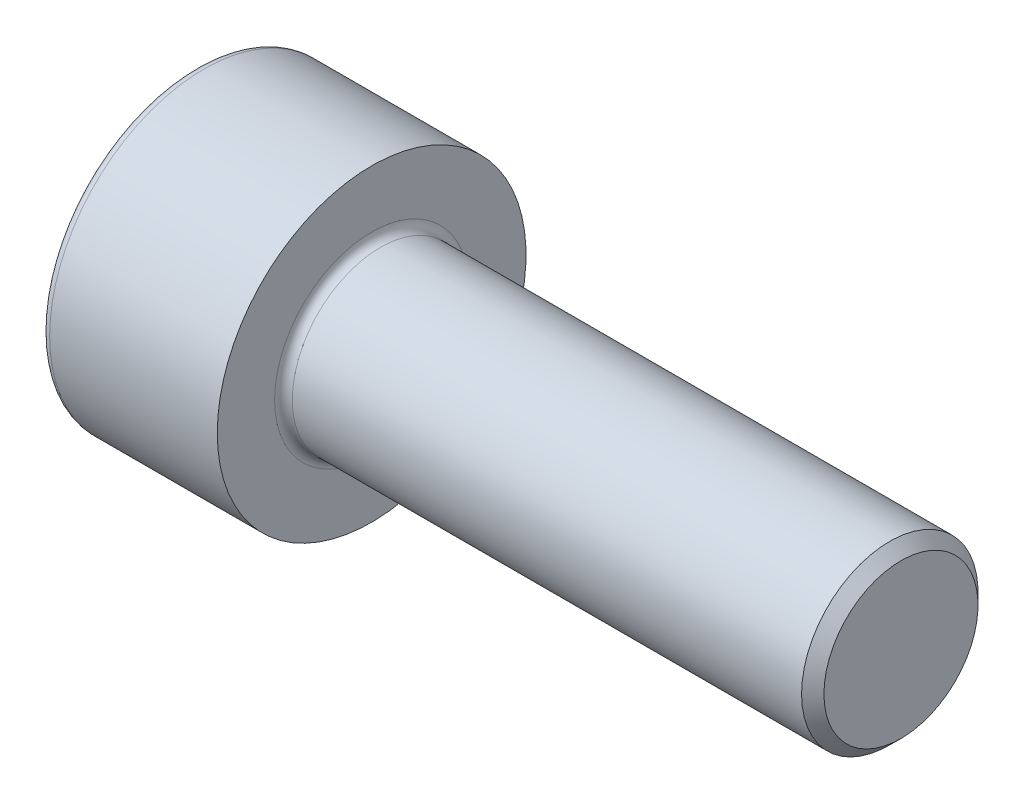
ISO-10303-21;
HEADER;
FILE_DESCRIPTION(('STEP AP214'),'2;1');
FILE_NAME('part.step','',(''),(''),'','','');
FILE_SCHEMA(('AUTOMOTIVE_DESIGN { 1 0 10303 214 1 1 1 1 }'));
ENDSEC;
DATA;
#1=APPLICATION_CONTEXT('core data for automotive mechanical design processes');
#2=APPLICATION_PROTOCOL_DEFINITION('international standard','automotive_design',2000,#1);
#3=PRODUCT_CONTEXT('',#1,'mechanical');
#4=PRODUCT('Part','Part','',(#3));
#5=PRODUCT_RELATED_PRODUCT_CATEGORY('part','',(#4));
#6=PRODUCT_DEFINITION_FORMATION('','',#4);
#7=PRODUCT_DEFINITION_CONTEXT('part definition',#1,'design');
#8=PRODUCT_DEFINITION('design','',#6,#7);
#9=PRODUCT_DEFINITION_SHAPE('','',#8);
#10=(LENGTH_UNIT() NAMED_UNIT(*) SI_UNIT(.MILLI.,.METRE.));
#11=(NAMED_UNIT(*) PLANE_ANGLE_UNIT() SI_UNIT($,.RADIAN.));
#12=(NAMED_UNIT(*) SI_UNIT($,.STERADIAN.) SOLID_ANGLE_UNIT());
#13=UNCERTAINTY_MEASURE_WITH_UNIT(LENGTH_MEASURE(1.E-05),#10,'distance_accuracy_value','');
#14=(GEOMETRIC_REPRESENTATION_CONTEXT(3) GLOBAL_UNCERTAINTY_ASSIGNED_CONTEXT((#13)) GLOBAL_UNIT_ASSIGNED_CONTEXT((#10,
#11,#12)) REPRESENTATION_CONTEXT('',''));
#15=CARTESIAN_POINT('',(0.,0.,0.));
#16=DIRECTION('',(0.,0.,1.));
#17=DIRECTION('',(1.,0.,0.));
#18=AXIS2_PLACEMENT_3D('',#15,#16,#17);
#19=CARTESIAN_POINT('',(12.,0.,0.));
#20=DIRECTION('',(-1.,0.,0.));
#21=DIRECTION('',(0.,0.,1.));
#22=AXIS2_PLACEMENT_3D('',#19,#20,#21);
#23=CONICAL_SURFACE('',#22,1.7464999999935,0.785398163397449);
#24=CARTESIAN_POINT('',(11.7464999999935,0.,0.));
#25=DIRECTION('',(-1.,0.,0.));
#26=DIRECTION('',(0.,0.,1.));
#27=AXIS2_PLACEMENT_3D('',#24,#25,#26);
#28=CIRCLE('',#27,2.);
#29=CARTESIAN_POINT('',(11.7464999999935,0.,2.));
#30=VERTEX_POINT('',#29);
#31=EDGE_CURVE('E11',#30,#30,#28,.T.);
#32=ORIENTED_EDGE('',*,*,#31,.F.);
#33=EDGE_LOOP('',(#32));
#34=FACE_BOUND('',#33,.T.);
#35=CARTESIAN_POINT('',(12.,0.,0.));
#36=DIRECTION('',(-1.,0.,0.));
#37=DIRECTION('',(0.,0.,1.));
#38=AXIS2_PLACEMENT_3D('',#35,#36,#37);
#39=CIRCLE('',#38,1.7464999999935);
#40=CARTESIAN_POINT('',(12.,0.,1.7464999999935));
#41=VERTEX_POINT('',#40);
#42=EDGE_CURVE('E134',#41,#41,#39,.T.);
#43=ORIENTED_EDGE('',*,*,#42,.T.);
#44=EDGE_LOOP('',(#43));
#45=FACE_BOUND('',#44,.T.);
#46=ADVANCED_FACE('F33',(#34,#45),#23,.T.);
#47=CARTESIAN_POINT('',(-4.,0.,0.));
#48=DIRECTION('',(-1.,0.,0.));
#49=DIRECTION('',(0.,0.,1.));
#50=AXIS2_PLACEMENT_3D('',#47,#48,#49);
#51=CYLINDRICAL_SURFACE('',#50,2.);
#52=CARTESIAN_POINT('',(0.200000000000001,0.,0.));
#53=DIRECTION('',(-1.,0.,0.));
#54=DIRECTION('',(0.,0.,1.));
#55=AXIS2_PLACEMENT_3D('',#52,#53,#54);
#56=CIRCLE('',#55,2.);
#57=CARTESIAN_POINT('',(0.200000000000001,0.,2.));
#58=VERTEX_POINT('',#57);
#59=EDGE_CURVE('E40',#58,#58,#56,.T.);
#60=ORIENTED_EDGE('',*,*,#59,.F.);
#61=EDGE_LOOP('',(#60));
#62=FACE_BOUND('',#61,.T.);
#63=ORIENTED_EDGE('',*,*,#31,.T.);
#64=EDGE_LOOP('',(#63));
#65=FACE_BOUND('',#64,.T.);
#66=ADVANCED_FACE('F158',(#62,#65),#51,.T.);
#67=CARTESIAN_POINT('',(0.2,0.,0.));
#68=DIRECTION('',(-1.,0.,0.));
#69=DIRECTION('',(0.,0.,1.));
#70=AXIS2_PLACEMENT_3D('',#67,#68,#69);
#71=TOROIDAL_SURFACE('',#70,2.2,0.2);
#72=CARTESIAN_POINT('',(0.,0.,0.));
#73=DIRECTION('',(-1.,0.,0.));
#74=DIRECTION('',(0.,0.,1.));
#75=AXIS2_PLACEMENT_3D('',#72,#73,#74);
#76=CIRCLE('',#75,2.2);
#77=CARTESIAN_POINT('',(0.,0.,2.2));
#78=VERTEX_POINT('',#77);
#79=EDGE_CURVE('E151',#78,#78,#76,.T.);
#80=ORIENTED_EDGE('',*,*,#79,.F.);
#81=EDGE_LOOP('',(#80));
#82=FACE_BOUND('',#81,.T.);
#83=ORIENTED_EDGE('',*,*,#59,.T.);
#84=EDGE_LOOP('',(#83));
#85=FACE_BOUND('',#84,.T.);
#86=ADVANCED_FACE('F156',(#82,#85),#71,.F.);
#87=CARTESIAN_POINT('',(0.,2.2,0.));
#88=DIRECTION('',(-1.,0.,0.));
#89=DIRECTION('',(0.,0.,1.));
#90=AXIS2_PLACEMENT_3D('',#87,#88,#89);
#91=PLANE('',#90);
#92=CARTESIAN_POINT('',(0.,0.,0.));
#93=DIRECTION('',(-1.,0.,0.));
#94=DIRECTION('',(0.,0.,1.));
#95=AXIS2_PLACEMENT_3D('',#92,#93,#94);
#96=CIRCLE('',#95,3.5);
#97=CARTESIAN_POINT('',(0.,0.,3.5));
#98=VERTEX_POINT('',#97);
#99=EDGE_CURVE('E148',#98,#98,#96,.T.);
#100=ORIENTED_EDGE('',*,*,#99,.F.);
#101=EDGE_LOOP('',(#100));
#102=FACE_BOUND('',#101,.T.);
#103=ORIENTED_EDGE('',*,*,#79,.T.);
#104=EDGE_LOOP('',(#103));
#105=FACE_BOUND('',#104,.T.);
#106=ADVANCED_FACE('F189',(#102,#105),#91,.F.);
#107=CARTESIAN_POINT('',(-4.,0.,0.));
#108=DIRECTION('',(-1.,0.,0.));
#109=DIRECTION('',(0.,0.,1.));
#110=AXIS2_PLACEMENT_3D('',#107,#108,#109);
#111=CYLINDRICAL_SURFACE('',#110,3.5);
#112=CARTESIAN_POINT('',(-3.8,0.,0.));
#113=DIRECTION('',(-1.,0.,0.));
#114=DIRECTION('',(0.,0.,1.));
#115=AXIS2_PLACEMENT_3D('',#112,#113,#114);
#116=CIRCLE('',#115,3.5);
#117=CARTESIAN_POINT('',(-3.8,0.,3.5));
#118=VERTEX_POINT('',#117);
#119=EDGE_CURVE('E145',#118,#118,#116,.T.);
#120=ORIENTED_EDGE('',*,*,#119,.F.);
#121=EDGE_LOOP('',(#120));
#122=FACE_BOUND('',#121,.T.);
#123=ORIENTED_EDGE('',*,*,#99,.T.);
#124=EDGE_LOOP('',(#123));
#125=FACE_BOUND('',#124,.T.);
#126=ADVANCED_FACE('F185',(#122,#125),#111,.T.);
#127=CARTESIAN_POINT('',(-3.8,0.,0.));
#128=DIRECTION('',(-1.,0.,0.));
#129=DIRECTION('',(0.,0.,1.));
#130=AXIS2_PLACEMENT_3D('',#127,#128,#129);
#131=TOROIDAL_SURFACE('',#130,3.3,0.200000000000001);
#132=CARTESIAN_POINT('',(-4.,0.,0.));
#133=DIRECTION('',(-1.,0.,0.));
#134=DIRECTION('',(0.,0.,1.));
#135=AXIS2_PLACEMENT_3D('',#132,#133,#134);
#136=CIRCLE('',#135,3.3);
#137=CARTESIAN_POINT('',(-4.,0.,3.3));
#138=VERTEX_POINT('',#137);
#139=EDGE_CURVE('E142',#138,#138,#136,.T.);
#140=ORIENTED_EDGE('',*,*,#139,.F.);
#141=EDGE_LOOP('',(#140));
#142=FACE_BOUND('',#141,.T.);
#143=ORIENTED_EDGE('',*,*,#119,.T.);
#144=EDGE_LOOP('',(#143));
#145=FACE_BOUND('',#144,.T.);
#146=ADVANCED_FACE('F178',(#142,#145),#131,.T.);
#147=CARTESIAN_POINT('',(-4.,3.3,0.));
#148=DIRECTION('',(1.,0.,0.));
#149=DIRECTION('',(0.,0.,-1.));
#150=AXIS2_PLACEMENT_3D('',#147,#148,#149);
#151=PLANE('',#150);
#152=DIRECTION('',(0.,0.5,-0.866025403784438));
#153=VECTOR('',#152,1.);
#154=CARTESIAN_POINT('',(-4.,0.886232663206076,1.535));
#155=LINE('',#154,#153);
#156=CARTESIAN_POINT('',(-4.,0.886232663206076,1.535));
#157=VERTEX_POINT('',#156);
#158=CARTESIAN_POINT('',(-4.,1.77246532641215,0.));
#159=VERTEX_POINT('',#158);
#160=EDGE_CURVE('E121',#157,#159,#155,.T.);
#161=ORIENTED_EDGE('',*,*,#160,.F.);
#162=DIRECTION('',(0.,1.,0.));
#163=VECTOR('',#162,1.);
#164=CARTESIAN_POINT('',(-4.,-0.886232663206076,1.535));
#165=LINE('',#164,#163);
#166=CARTESIAN_POINT('',(-4.,-0.886232663206076,1.535));
#167=VERTEX_POINT('',#166);
#168=EDGE_CURVE('E47',#167,#157,#165,.T.);
#169=ORIENTED_EDGE('',*,*,#168,.F.);
#170=DIRECTION('',(0.,0.5,0.866025403784439));
#171=VECTOR('',#170,1.);
#172=CARTESIAN_POINT('',(-4.,-1.77246532641215,0.));
#173=LINE('',#172,#171);
#174=CARTESIAN_POINT('',(-4.,-1.77246532641215,0.));
#175=VERTEX_POINT('',#174);
#176=EDGE_CURVE('E130',#175,#167,#173,.T.);
#177=ORIENTED_EDGE('',*,*,#176,.F.);
#178=DIRECTION('',(0.,-0.5,0.866025403784439));
#179=VECTOR('',#178,1.);
#180=CARTESIAN_POINT('',(-4.,-0.886232663206076,-1.535));
#181=LINE('',#180,#179);
#182=CARTESIAN_POINT('',(-4.,-0.886232663206076,-1.535));
#183=VERTEX_POINT('',#182);
#184=EDGE_CURVE('E128',#183,#175,#181,.T.);
#185=ORIENTED_EDGE('',*,*,#184,.F.);
#186=DIRECTION('',(0.,-1.,0.));
#187=VECTOR('',#186,1.);
#188=CARTESIAN_POINT('',(-4.,0.886232663206076,-1.535));
#189=LINE('',#188,#187);
#190=CARTESIAN_POINT('',(-4.,0.886232663206076,-1.535));
#191=VERTEX_POINT('',#190);
#192=EDGE_CURVE('E95',#191,#183,#189,.T.);
#193=ORIENTED_EDGE('',*,*,#192,.F.);
#194=DIRECTION('',(0.,-0.5,-0.866025403784439));
#195=VECTOR('',#194,1.);
#196=CARTESIAN_POINT('',(-4.,1.77246532641215,0.));
#197=LINE('',#196,#195);
#198=EDGE_CURVE('E124',#159,#191,#197,.T.);
#199=ORIENTED_EDGE('',*,*,#198,.F.);
#200=EDGE_LOOP('',(#161,#169,#177,#185,#193,#199));
#201=FACE_BOUND('',#200,.T.);
#202=ORIENTED_EDGE('',*,*,#139,.T.);
#203=EDGE_LOOP('',(#202));
#204=FACE_BOUND('',#203,.T.);
#205=ADVANCED_FACE('F170',(#201,#204),#151,.F.);
#206=CARTESIAN_POINT('',(12.,1.7464999999935,0.));
#207=DIRECTION('',(-1.,0.,0.));
#208=DIRECTION('',(0.,0.,1.));
#209=AXIS2_PLACEMENT_3D('',#206,#207,#208);
#210=PLANE('',#209);
#211=ORIENTED_EDGE('',*,*,#42,.F.);
#212=EDGE_LOOP('',(#211));
#213=FACE_BOUND('',#212,.T.);
#214=ADVANCED_FACE('F167',(#213),#210,.F.);
#215=CARTESIAN_POINT('',(-2.,-0.886232663206076,1.535));
#216=DIRECTION('',(0.,0.,1.));
#217=DIRECTION('',(1.,0.,0.));
#218=AXIS2_PLACEMENT_3D('',#215,#216,#217);
#219=PLANE('',#218);
#220=ORIENTED_EDGE('',*,*,#168,.T.);
#221=DIRECTION('',(-1.,0.,0.));
#222=VECTOR('',#221,1.);
#223=CARTESIAN_POINT('',(-2.,0.886232663206076,1.535));
#224=LINE('',#223,#222);
#225=CARTESIAN_POINT('',(-2.,0.886232663206076,1.535));
#226=VERTEX_POINT('',#225);
#227=EDGE_CURVE('E77',#226,#157,#224,.T.);
#228=ORIENTED_EDGE('',*,*,#227,.F.);
#229=DIRECTION('',(0.,1.,0.));
#230=VECTOR('',#229,1.);
#231=CARTESIAN_POINT('',(-2.,-0.886232663206076,1.535));
#232=LINE('',#231,#230);
#233=CARTESIAN_POINT('',(-2.,-0.886232663206076,1.535));
#234=VERTEX_POINT('',#233);
#235=EDGE_CURVE('E132',#234,#226,#232,.T.);
#236=ORIENTED_EDGE('',*,*,#235,.F.);
#237=DIRECTION('',(-1.,0.,0.));
#238=VECTOR('',#237,1.);
#239=CARTESIAN_POINT('',(-2.,-0.886232663206076,1.535));
#240=LINE('',#239,#238);
#241=EDGE_CURVE('E55',#234,#167,#240,.T.);
#242=ORIENTED_EDGE('',*,*,#241,.T.);
#243=EDGE_LOOP('',(#220,#228,#236,#242));
#244=FACE_BOUND('',#243,.T.);
#245=ADVANCED_FACE('F169',(#244),#219,.F.);
#246=CARTESIAN_POINT('',(-2.,-1.77246532641215,0.));
#247=DIRECTION('',(0.,-0.866025403784439,0.5));
#248=DIRECTION('',(0.,-0.5,-0.866025403784439));
#249=AXIS2_PLACEMENT_3D('',#246,#247,#248);
#250=PLANE('',#249);
#251=ORIENTED_EDGE('',*,*,#176,.T.);
#252=ORIENTED_EDGE('',*,*,#241,.F.);
#253=DIRECTION('',(0.,0.5,0.866025403784439));
#254=VECTOR('',#253,1.);
#255=CARTESIAN_POINT('',(-2.,-1.77246532641215,0.));
#256=LINE('',#255,#254);
#257=CARTESIAN_POINT('',(-2.,-1.77246532641215,0.));
#258=VERTEX_POINT('',#257);
#259=EDGE_CURVE('E107',#258,#234,#256,.T.);
#260=ORIENTED_EDGE('',*,*,#259,.F.);
#261=DIRECTION('',(-1.,0.,0.));
#262=VECTOR('',#261,1.);
#263=CARTESIAN_POINT('',(-2.,-1.77246532641215,0.));
#264=LINE('',#263,#262);
#265=EDGE_CURVE('E99',#258,#175,#264,.T.);
#266=ORIENTED_EDGE('',*,*,#265,.T.);
#267=EDGE_LOOP('',(#251,#252,#260,#266));
#268=FACE_BOUND('',#267,.T.);
#269=ADVANCED_FACE('F176',(#268),#250,.F.);
#270=CARTESIAN_POINT('',(-2.,-0.886232663206076,-1.535));
#271=DIRECTION('',(0.,-0.866025403784439,-0.5));
#272=DIRECTION('',(0.,0.5,-0.866025403784439));
#273=AXIS2_PLACEMENT_3D('',#270,#271,#272);
#274=PLANE('',#273);
#275=ORIENTED_EDGE('',*,*,#184,.T.);
#276=ORIENTED_EDGE('',*,*,#265,.F.);
#277=DIRECTION('',(0.,-0.5,0.866025403784439));
#278=VECTOR('',#277,1.);
#279=CARTESIAN_POINT('',(-2.,-0.886232663206076,-1.535));
#280=LINE('',#279,#278);
#281=CARTESIAN_POINT('',(-2.,-0.886232663206076,-1.535));
#282=VERTEX_POINT('',#281);
#283=EDGE_CURVE('E103',#282,#258,#280,.T.);
#284=ORIENTED_EDGE('',*,*,#283,.F.);
#285=DIRECTION('',(-1.,0.,0.));
#286=VECTOR('',#285,1.);
#287=CARTESIAN_POINT('',(-2.,-0.886232663206076,-1.535));
#288=LINE('',#287,#286);
#289=EDGE_CURVE('E88',#282,#183,#288,.T.);
#290=ORIENTED_EDGE('',*,*,#289,.T.);
#291=EDGE_LOOP('',(#275,#276,#284,#290));
#292=FACE_BOUND('',#291,.T.);
#293=ADVANCED_FACE('F104',(#292),#274,.F.);
#294=CARTESIAN_POINT('',(-2.,0.886232663206076,-1.535));
#295=DIRECTION('',(0.,0.,-1.));
#296=DIRECTION('',(0.,1.,0.));
#297=AXIS2_PLACEMENT_3D('',#294,#295,#296);
#298=PLANE('',#297);
#299=ORIENTED_EDGE('',*,*,#192,.T.);
#300=ORIENTED_EDGE('',*,*,#289,.F.);
#301=DIRECTION('',(0.,-1.,0.));
#302=VECTOR('',#301,1.);
#303=CARTESIAN_POINT('',(-2.,0.886232663206076,-1.535));
#304=LINE('',#303,#302);
#305=CARTESIAN_POINT('',(-2.,0.886232663206076,-1.535));
#306=VERTEX_POINT('',#305);
#307=EDGE_CURVE('E92',#306,#282,#304,.T.);
#308=ORIENTED_EDGE('',*,*,#307,.F.);
#309=DIRECTION('',(-1.,0.,0.));
#310=VECTOR('',#309,1.);
#311=CARTESIAN_POINT('',(-2.,0.886232663206076,-1.535));
#312=LINE('',#311,#310);
#313=EDGE_CURVE('E100',#306,#191,#312,.T.);
#314=ORIENTED_EDGE('',*,*,#313,.T.);
#315=EDGE_LOOP('',(#299,#300,#308,#314));
#316=FACE_BOUND('',#315,.T.);
#317=ADVANCED_FACE('F90',(#316),#298,.F.);
#318=CARTESIAN_POINT('',(-2.,1.77246532641215,0.));
#319=DIRECTION('',(0.,0.866025403784439,-0.5));
#320=DIRECTION('',(0.,0.5,0.866025403784439));
#321=AXIS2_PLACEMENT_3D('',#318,#319,#320);
#322=PLANE('',#321);
#323=ORIENTED_EDGE('',*,*,#198,.T.);
#324=ORIENTED_EDGE('',*,*,#313,.F.);
#325=DIRECTION('',(0.,-0.5,-0.866025403784439));
#326=VECTOR('',#325,1.);
#327=CARTESIAN_POINT('',(-2.,1.77246532641215,0.));
#328=LINE('',#327,#326);
#329=CARTESIAN_POINT('',(-2.,1.77246532641215,0.));
#330=VERTEX_POINT('',#329);
#331=EDGE_CURVE('E113',#330,#306,#328,.T.);
#332=ORIENTED_EDGE('',*,*,#331,.F.);
#333=DIRECTION('',(-1.,0.,0.));
#334=VECTOR('',#333,1.);
#335=CARTESIAN_POINT('',(-2.,1.77246532641215,0.));
#336=LINE('',#335,#334);
#337=EDGE_CURVE('E137',#330,#159,#336,.T.);
#338=ORIENTED_EDGE('',*,*,#337,.T.);
#339=EDGE_LOOP('',(#323,#324,#332,#338));
#340=FACE_BOUND('',#339,.T.);
#341=ADVANCED_FACE('F251',(#340),#322,.F.);
#342=CARTESIAN_POINT('',(-2.,0.886232663206076,1.535));
#343=DIRECTION('',(0.,0.866025403784439,0.5));
#344=DIRECTION('',(0.,-0.5,0.866025403784438));
#345=AXIS2_PLACEMENT_3D('',#342,#343,#344);
#346=PLANE('',#345);
#347=ORIENTED_EDGE('',*,*,#160,.T.);
#348=ORIENTED_EDGE('',*,*,#337,.F.);
#349=DIRECTION('',(0.,0.5,-0.866025403784438));
#350=VECTOR('',#349,1.);
#351=CARTESIAN_POINT('',(-2.,0.886232663206076,1.535));
#352=LINE('',#351,#350);
#353=EDGE_CURVE('E115',#226,#330,#352,.T.);
#354=ORIENTED_EDGE('',*,*,#353,.F.);
#355=ORIENTED_EDGE('',*,*,#227,.T.);
#356=EDGE_LOOP('',(#347,#348,#354,#355));
#357=FACE_BOUND('',#356,.T.);
#358=ADVANCED_FACE('F260',(#357),#346,.F.);
#359=CARTESIAN_POINT('',(-2.,0.,0.));
#360=DIRECTION('',(-1.,0.,0.));
#361=DIRECTION('',(0.,0.,1.));
#362=AXIS2_PLACEMENT_3D('',#359,#360,#361);
#363=PLANE('',#362);
#364=ORIENTED_EDGE('',*,*,#235,.T.);
#365=ORIENTED_EDGE('',*,*,#353,.T.);
#366=ORIENTED_EDGE('',*,*,#331,.T.);
#367=ORIENTED_EDGE('',*,*,#307,.T.);
#368=ORIENTED_EDGE('',*,*,#283,.T.);
#369=ORIENTED_EDGE('',*,*,#259,.T.);
#370=EDGE_LOOP('',(#364,#365,#366,#367,#368,#369));
#371=FACE_BOUND('',#370,.T.);
#372=ADVANCED_FACE('F110',(#371),#363,.T.);
#373=CLOSED_SHELL('',(#46,#66,#86,#106,#126,#146,#205,#214,#245,#269,#293,#317,#341,#358,#372));
#374=MANIFOLD_SOLID_BREP('B2',#373);
#375=ADVANCED_BREP_SHAPE_REPRESENTATION('',(#18,#374),#14);
#376=SHAPE_DEFINITION_REPRESENTATION(#9,#375);
ENDSEC;
END-ISO-10303-21;
